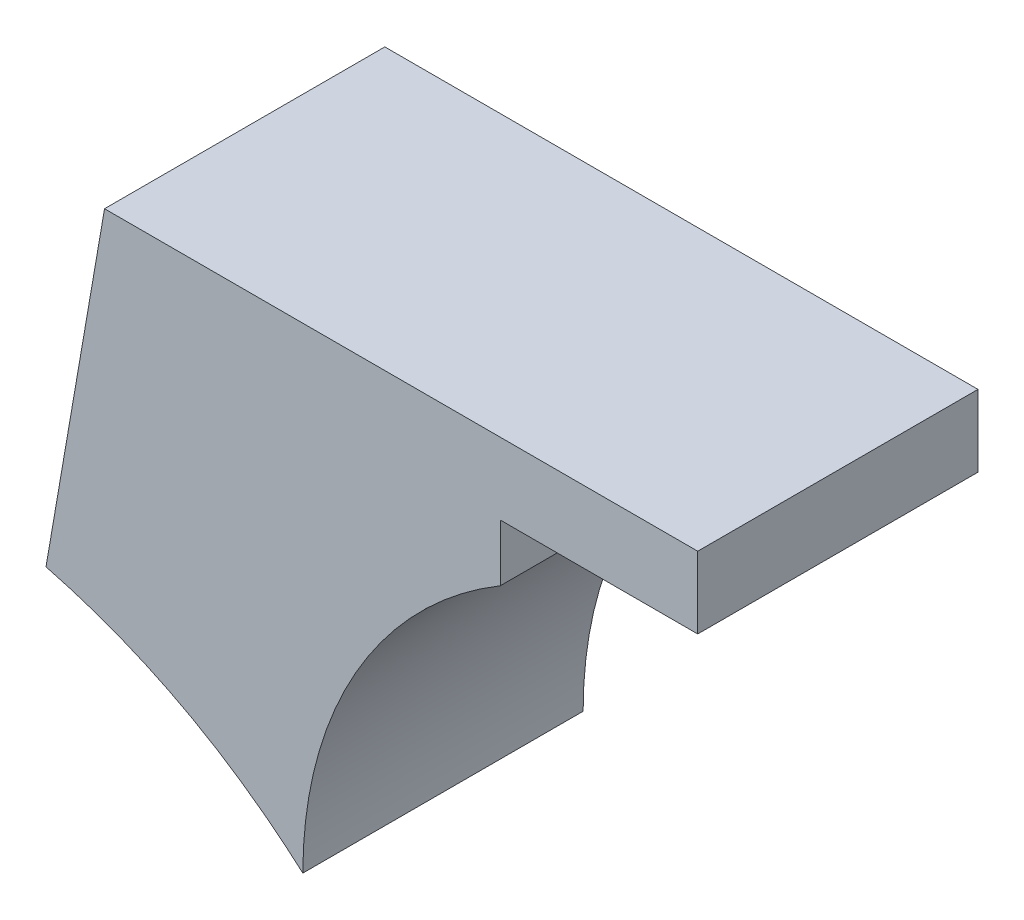
ISO-10303-21;
HEADER;
FILE_DESCRIPTION(('STEP AP214'),'2;1');
FILE_NAME('part.step','',(''),(''),'','','');
FILE_SCHEMA(('AUTOMOTIVE_DESIGN { 1 0 10303 214 1 1 1 1 }'));
ENDSEC;
DATA;
#1=APPLICATION_CONTEXT('core data for automotive mechanical design processes');
#2=APPLICATION_PROTOCOL_DEFINITION('international standard','automotive_design',2000,#1);
#3=PRODUCT_CONTEXT('',#1,'mechanical');
#4=PRODUCT('Part','Part','',(#3));
#5=PRODUCT_RELATED_PRODUCT_CATEGORY('part','',(#4));
#6=PRODUCT_DEFINITION_FORMATION('','',#4);
#7=PRODUCT_DEFINITION_CONTEXT('part definition',#1,'design');
#8=PRODUCT_DEFINITION('design','',#6,#7);
#9=PRODUCT_DEFINITION_SHAPE('','',#8);
#10=(LENGTH_UNIT() NAMED_UNIT(*) SI_UNIT(.MILLI.,.METRE.));
#11=(NAMED_UNIT(*) PLANE_ANGLE_UNIT() SI_UNIT($,.RADIAN.));
#12=(NAMED_UNIT(*) SI_UNIT($,.STERADIAN.) SOLID_ANGLE_UNIT());
#13=UNCERTAINTY_MEASURE_WITH_UNIT(LENGTH_MEASURE(1.E-05),#10,'distance_accuracy_value','');
#14=(GEOMETRIC_REPRESENTATION_CONTEXT(3) GLOBAL_UNCERTAINTY_ASSIGNED_CONTEXT((#13)) GLOBAL_UNIT_ASSIGNED_CONTEXT((#10,
#11,#12)) REPRESENTATION_CONTEXT('',''));
#15=CARTESIAN_POINT('',(0.,0.,0.));
#16=DIRECTION('',(0.,0.,1.));
#17=DIRECTION('',(1.,0.,0.));
#18=AXIS2_PLACEMENT_3D('',#15,#16,#17);
#19=CARTESIAN_POINT('',(0.,28.5235116301809,30.));
#20=DIRECTION('',(0.,-1.,0.));
#21=DIRECTION('',(1.,0.,0.));
#22=AXIS2_PLACEMENT_3D('',#19,#20,#21);
#23=PLANE('',#22);
#24=DIRECTION('',(0.,0.,-1.));
#25=VECTOR('',#24,1.);
#26=CARTESIAN_POINT('',(192.119809278409,28.5235116301809,30.));
#27=LINE('',#26,#25);
#28=CARTESIAN_POINT('',(192.119809278409,28.5235116301809,30.));
#29=VERTEX_POINT('',#28);
#30=CARTESIAN_POINT('',(192.119809278409,28.5235116301809,-30.));
#31=VERTEX_POINT('',#30);
#32=EDGE_CURVE('E51',#29,#31,#27,.T.);
#33=ORIENTED_EDGE('',*,*,#32,.T.);
#34=DIRECTION('',(-1.,0.,0.));
#35=VECTOR('',#34,1.);
#36=CARTESIAN_POINT('',(0.,28.5235116301809,-30.));
#37=LINE('',#36,#35);
#38=CARTESIAN_POINT('',(234.383754042939,28.5235116301809,-30.));
#39=VERTEX_POINT('',#38);
#40=EDGE_CURVE('E109',#39,#31,#37,.T.);
#41=ORIENTED_EDGE('',*,*,#40,.F.);
#42=DIRECTION('',(0.,0.,-1.));
#43=VECTOR('',#42,1.);
#44=CARTESIAN_POINT('',(234.383754042939,28.5235116301809,30.));
#45=LINE('',#44,#43);
#46=CARTESIAN_POINT('',(234.383754042939,28.5235116301809,30.));
#47=VERTEX_POINT('',#46);
#48=EDGE_CURVE('E11',#47,#39,#45,.T.);
#49=ORIENTED_EDGE('',*,*,#48,.F.);
#50=DIRECTION('',(-1.,0.,0.));
#51=VECTOR('',#50,1.);
#52=CARTESIAN_POINT('',(0.,28.5235116301809,30.));
#53=LINE('',#52,#51);
#54=EDGE_CURVE('E133',#47,#29,#53,.T.);
#55=ORIENTED_EDGE('',*,*,#54,.T.);
#56=EDGE_LOOP('',(#33,#41,#49,#55));
#57=FACE_BOUND('',#56,.T.);
#58=ADVANCED_FACE('F37',(#57),#23,.T.);
#59=CARTESIAN_POINT('',(234.383754042939,0.,30.));
#60=DIRECTION('',(1.,0.,0.));
#61=DIRECTION('',(0.,0.,-1.));
#62=AXIS2_PLACEMENT_3D('',#59,#60,#61);
#63=PLANE('',#62);
#64=ORIENTED_EDGE('',*,*,#48,.T.);
#65=DIRECTION('',(0.,-1.,0.));
#66=VECTOR('',#65,1.);
#67=CARTESIAN_POINT('',(234.383754042939,0.,-30.));
#68=LINE('',#67,#66);
#69=CARTESIAN_POINT('',(234.383754042939,43.8748420001809,-30.));
#70=VERTEX_POINT('',#69);
#71=EDGE_CURVE('E98',#70,#39,#68,.T.);
#72=ORIENTED_EDGE('',*,*,#71,.F.);
#73=DIRECTION('',(0.,0.,-1.));
#74=VECTOR('',#73,1.);
#75=CARTESIAN_POINT('',(234.383754042939,43.8748420001809,30.));
#76=LINE('',#75,#74);
#77=CARTESIAN_POINT('',(234.383754042939,43.8748420001809,30.));
#78=VERTEX_POINT('',#77);
#79=EDGE_CURVE('E44',#78,#70,#76,.T.);
#80=ORIENTED_EDGE('',*,*,#79,.F.);
#81=DIRECTION('',(0.,-1.,0.));
#82=VECTOR('',#81,1.);
#83=CARTESIAN_POINT('',(234.383754042939,0.,30.));
#84=LINE('',#83,#82);
#85=EDGE_CURVE('E100',#78,#47,#84,.T.);
#86=ORIENTED_EDGE('',*,*,#85,.T.);
#87=EDGE_LOOP('',(#64,#72,#80,#86));
#88=FACE_BOUND('',#87,.T.);
#89=ADVANCED_FACE('F97',(#88),#63,.T.);
#90=CARTESIAN_POINT('',(0.,43.8748420001809,30.));
#91=DIRECTION('',(0.,1.,0.));
#92=DIRECTION('',(0.,0.,1.));
#93=AXIS2_PLACEMENT_3D('',#90,#91,#92);
#94=PLANE('',#93);
#95=ORIENTED_EDGE('',*,*,#79,.T.);
#96=DIRECTION('',(1.,0.,0.));
#97=VECTOR('',#96,1.);
#98=CARTESIAN_POINT('',(0.,43.8748420001809,-30.));
#99=LINE('',#98,#97);
#100=CARTESIAN_POINT('',(107.40504349076,43.8748420001809,-30.));
#101=VERTEX_POINT('',#100);
#102=EDGE_CURVE('E112',#101,#70,#99,.T.);
#103=ORIENTED_EDGE('',*,*,#102,.F.);
#104=DIRECTION('',(0.,0.,-1.));
#105=VECTOR('',#104,1.);
#106=CARTESIAN_POINT('',(107.40504349076,43.8748420001809,30.));
#107=LINE('',#106,#105);
#108=CARTESIAN_POINT('',(107.40504349076,43.8748420001809,30.));
#109=VERTEX_POINT('',#108);
#110=EDGE_CURVE('E248',#109,#101,#107,.T.);
#111=ORIENTED_EDGE('',*,*,#110,.F.);
#112=DIRECTION('',(1.,0.,0.));
#113=VECTOR('',#112,1.);
#114=CARTESIAN_POINT('',(0.,43.8748420001809,30.));
#115=LINE('',#114,#113);
#116=EDGE_CURVE('E136',#109,#78,#115,.T.);
#117=ORIENTED_EDGE('',*,*,#116,.T.);
#118=EDGE_LOOP('',(#95,#103,#111,#117));
#119=FACE_BOUND('',#118,.T.);
#120=ADVANCED_FACE('F161',(#119),#94,.T.);
#121=CARTESIAN_POINT('',(96.9542007058559,-16.7213884622832,30.));
#122=DIRECTION('',(0.985451355131345,-0.169957720241815,0.));
#123=DIRECTION('',(0.169957720241815,0.985451355131346,0.));
#124=AXIS2_PLACEMENT_3D('',#121,#122,#123);
#125=PLANE('',#124);
#126=ORIENTED_EDGE('',*,*,#110,.T.);
#127=DIRECTION('',(-0.169957720241815,-0.985451355131346,0.));
#128=VECTOR('',#127,1.);
#129=CARTESIAN_POINT('',(96.9542007058559,-16.7213884622832,-30.));
#130=LINE('',#129,#128);
#131=CARTESIAN_POINT('',(94.874715103594,-28.7786924894815,-30.));
#132=VERTEX_POINT('',#131);
#133=EDGE_CURVE('E117',#101,#132,#130,.T.);
#134=ORIENTED_EDGE('',*,*,#133,.T.);
#135=DIRECTION('',(0.,0.,-1.));
#136=VECTOR('',#135,1.);
#137=CARTESIAN_POINT('',(94.874715103594,-28.7786924894815,30.));
#138=LINE('',#137,#136);
#139=CARTESIAN_POINT('',(94.874715103594,-28.7786924894815,30.));
#140=VERTEX_POINT('',#139);
#141=EDGE_CURVE('E246',#140,#132,#138,.T.);
#142=ORIENTED_EDGE('',*,*,#141,.F.);
#143=DIRECTION('',(-0.169957720241815,-0.985451355131346,0.));
#144=VECTOR('',#143,1.);
#145=CARTESIAN_POINT('',(96.9542007058559,-16.7213884622832,30.));
#146=LINE('',#145,#144);
#147=EDGE_CURVE('E139',#109,#140,#146,.T.);
#148=ORIENTED_EDGE('',*,*,#147,.F.);
#149=EDGE_LOOP('',(#126,#134,#142,#148));
#150=FACE_BOUND('',#149,.T.);
#151=ADVANCED_FACE('F156',(#150),#125,.F.);
#152=CARTESIAN_POINT('',(94.8747151035941,-28.7786924894815,30.));
#153=CARTESIAN_POINT('',(125.819297310027,-36.7658527288833,30.));
#154=CARTESIAN_POINT('',(149.85586451388,-58.0677160071102,30.));
#155=B_SPLINE_CURVE_WITH_KNOTS('',2,(#152,#153,#154),.UNSPECIFIED.,.F.,.F.,(3,3),(0.,1.),.UNSPECIFIED.);
#156=DIRECTION('',(0.,0.,-1.));
#157=VECTOR('',#156,1.);
#158=SURFACE_OF_LINEAR_EXTRUSION('',#155,#157);
#159=ORIENTED_EDGE('',*,*,#141,.T.);
#160=CARTESIAN_POINT('',(94.8747151035941,-28.7786924894815,-30.));
#161=CARTESIAN_POINT('',(125.819297310027,-36.7658527288833,-30.));
#162=CARTESIAN_POINT('',(149.85586451388,-58.0677160071102,-30.));
#163=B_SPLINE_CURVE_WITH_KNOTS('',2,(#160,#161,#162),.UNSPECIFIED.,.F.,.F.,(3,3),(0.,1.),.UNSPECIFIED.);
#164=CARTESIAN_POINT('',(149.85586451388,-58.0677160071102,-30.));
#165=VERTEX_POINT('',#164);
#166=EDGE_CURVE('E120',#132,#165,#163,.T.);
#167=ORIENTED_EDGE('',*,*,#166,.T.);
#168=DIRECTION('',(0.,0.,-1.));
#169=VECTOR('',#168,1.);
#170=CARTESIAN_POINT('',(149.85586451388,-58.0677160071102,30.));
#171=LINE('',#170,#169);
#172=CARTESIAN_POINT('',(149.85586451388,-58.0677160071102,30.));
#173=VERTEX_POINT('',#172);
#174=EDGE_CURVE('E244',#173,#165,#171,.T.);
#175=ORIENTED_EDGE('',*,*,#174,.F.);
#176=EDGE_CURVE('E141',#140,#173,#155,.T.);
#177=ORIENTED_EDGE('',*,*,#176,.F.);
#178=EDGE_LOOP('',(#159,#167,#175,#177));
#179=FACE_BOUND('',#178,.T.);
#180=ADVANCED_FACE('F151',(#179),#158,.F.);
#181=CARTESIAN_POINT('',(236.472275343207,-58.0677160071102,30.));
#182=DIRECTION('',(0.,0.,-1.));
#183=DIRECTION('',(-1.,0.,0.));
#184=AXIS2_PLACEMENT_3D('',#181,#182,#183);
#185=CYLINDRICAL_SURFACE('',#184,86.6164108293275);
#186=ORIENTED_EDGE('',*,*,#174,.T.);
#187=CARTESIAN_POINT('',(236.472275343207,-58.0677160071102,-30.));
#188=DIRECTION('',(0.,0.,1.));
#189=DIRECTION('',(1.,0.,0.));
#190=AXIS2_PLACEMENT_3D('',#187,#188,#189);
#191=CIRCLE('',#190,86.6164108293275);
#192=CARTESIAN_POINT('',(192.119809278409,16.3316212139013,-30.));
#193=VERTEX_POINT('',#192);
#194=EDGE_CURVE('E125',#165,#193,#191,.F.);
#195=ORIENTED_EDGE('',*,*,#194,.T.);
#196=DIRECTION('',(0.,0.,-1.));
#197=VECTOR('',#196,1.);
#198=CARTESIAN_POINT('',(192.119809278409,16.3316212139013,30.));
#199=LINE('',#198,#197);
#200=CARTESIAN_POINT('',(192.119809278409,16.3316212139013,30.));
#201=VERTEX_POINT('',#200);
#202=EDGE_CURVE('E240',#201,#193,#199,.T.);
#203=ORIENTED_EDGE('',*,*,#202,.F.);
#204=CARTESIAN_POINT('',(236.472275343207,-58.0677160071102,30.));
#205=DIRECTION('',(0.,0.,1.));
#206=DIRECTION('',(1.,0.,0.));
#207=AXIS2_PLACEMENT_3D('',#204,#205,#206);
#208=CIRCLE('',#207,86.6164108293275);
#209=EDGE_CURVE('E59',#173,#201,#208,.F.);
#210=ORIENTED_EDGE('',*,*,#209,.F.);
#211=EDGE_LOOP('',(#186,#195,#203,#210));
#212=FACE_BOUND('',#211,.T.);
#213=ADVANCED_FACE('F155',(#212),#185,.F.);
#214=CARTESIAN_POINT('',(192.119809278409,1.93699828259412E-13,30.));
#215=DIRECTION('',(1.,0.,0.));
#216=DIRECTION('',(0.,1.,0.));
#217=AXIS2_PLACEMENT_3D('',#214,#215,#216);
#218=PLANE('',#217);
#219=ORIENTED_EDGE('',*,*,#202,.T.);
#220=DIRECTION('',(0.,-1.,0.));
#221=VECTOR('',#220,1.);
#222=CARTESIAN_POINT('',(192.119809278409,1.93699828259412E-13,-30.));
#223=LINE('',#222,#221);
#224=EDGE_CURVE('E131',#31,#193,#223,.T.);
#225=ORIENTED_EDGE('',*,*,#224,.F.);
#226=ORIENTED_EDGE('',*,*,#32,.F.);
#227=DIRECTION('',(0.,-1.,0.));
#228=VECTOR('',#227,1.);
#229=CARTESIAN_POINT('',(192.119809278409,1.93699828259412E-13,30.));
#230=LINE('',#229,#228);
#231=EDGE_CURVE('E239',#29,#201,#230,.T.);
#232=ORIENTED_EDGE('',*,*,#231,.T.);
#233=EDGE_LOOP('',(#219,#225,#226,#232));
#234=FACE_BOUND('',#233,.T.);
#235=ADVANCED_FACE('F213',(#234),#218,.T.);
#236=CARTESIAN_POINT('',(0.,0.,30.));
#237=DIRECTION('',(0.,0.,1.));
#238=DIRECTION('',(1.,0.,0.));
#239=AXIS2_PLACEMENT_3D('',#236,#237,#238);
#240=PLANE('',#239);
#241=ORIENTED_EDGE('',*,*,#54,.F.);
#242=ORIENTED_EDGE('',*,*,#85,.F.);
#243=ORIENTED_EDGE('',*,*,#116,.F.);
#244=ORIENTED_EDGE('',*,*,#147,.T.);
#245=ORIENTED_EDGE('',*,*,#176,.T.);
#246=ORIENTED_EDGE('',*,*,#209,.T.);
#247=ORIENTED_EDGE('',*,*,#231,.F.);
#248=EDGE_LOOP('',(#241,#242,#243,#244,#245,#246,#247));
#249=FACE_BOUND('',#248,.T.);
#250=ADVANCED_FACE('F179',(#249),#240,.T.);
#251=CARTESIAN_POINT('',(0.,0.,-30.));
#252=DIRECTION('',(0.,0.,1.));
#253=DIRECTION('',(1.,0.,0.));
#254=AXIS2_PLACEMENT_3D('',#251,#252,#253);
#255=PLANE('',#254);
#256=ORIENTED_EDGE('',*,*,#40,.T.);
#257=ORIENTED_EDGE('',*,*,#224,.T.);
#258=ORIENTED_EDGE('',*,*,#194,.F.);
#259=ORIENTED_EDGE('',*,*,#166,.F.);
#260=ORIENTED_EDGE('',*,*,#133,.F.);
#261=ORIENTED_EDGE('',*,*,#102,.T.);
#262=ORIENTED_EDGE('',*,*,#71,.T.);
#263=EDGE_LOOP('',(#256,#257,#258,#259,#260,#261,#262));
#264=FACE_BOUND('',#263,.T.);
#265=ADVANCED_FACE('F107',(#264),#255,.F.);
#266=CLOSED_SHELL('',(#58,#89,#120,#151,#180,#213,#235,#250,#265));
#267=MANIFOLD_SOLID_BREP('B2',#266);
#268=ADVANCED_BREP_SHAPE_REPRESENTATION('',(#18,#267),#14);
#269=SHAPE_DEFINITION_REPRESENTATION(#9,#268);
ENDSEC;
END-ISO-10303-21;
